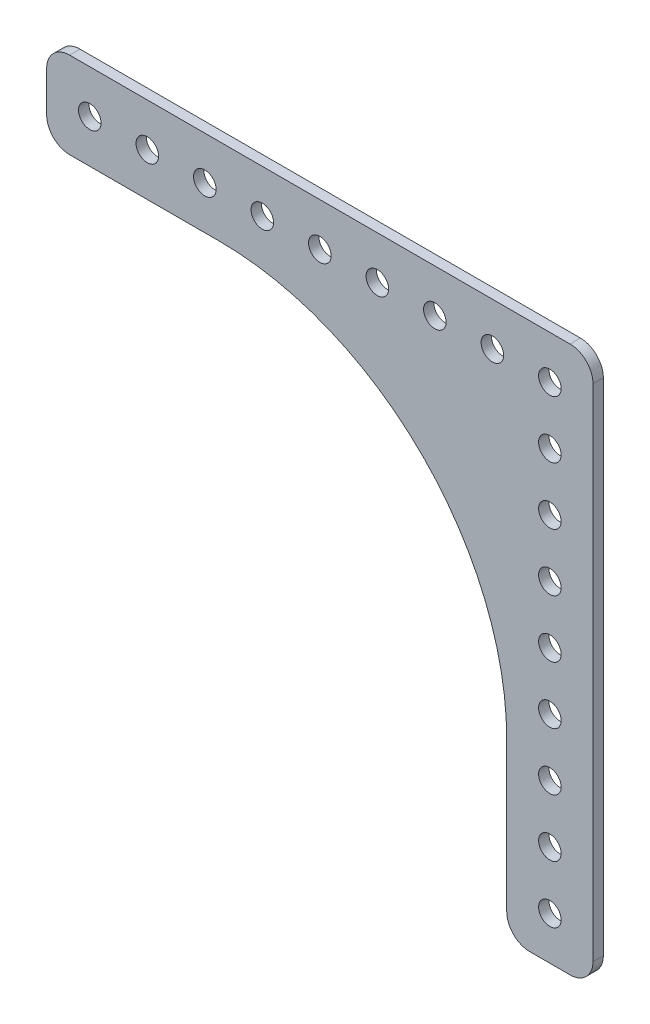
ISO-10303-21;
HEADER;
FILE_DESCRIPTION(('STEP AP214'),'2;1');
FILE_NAME('part.step','',(''),(''),'','','');
FILE_SCHEMA(('AUTOMOTIVE_DESIGN { 1 0 10303 214 1 1 1 1 }'));
ENDSEC;
DATA;
#1=APPLICATION_CONTEXT('core data for automotive mechanical design processes');
#2=APPLICATION_PROTOCOL_DEFINITION('international standard','automotive_design',2000,#1);
#3=PRODUCT_CONTEXT('',#1,'mechanical');
#4=PRODUCT('Part','Part','',(#3));
#5=PRODUCT_RELATED_PRODUCT_CATEGORY('part','',(#4));
#6=PRODUCT_DEFINITION_FORMATION('','',#4);
#7=PRODUCT_DEFINITION_CONTEXT('part definition',#1,'design');
#8=PRODUCT_DEFINITION('design','',#6,#7);
#9=PRODUCT_DEFINITION_SHAPE('','',#8);
#10=(LENGTH_UNIT() NAMED_UNIT(*) SI_UNIT(.MILLI.,.METRE.));
#11=(NAMED_UNIT(*) PLANE_ANGLE_UNIT() SI_UNIT($,.RADIAN.));
#12=(NAMED_UNIT(*) SI_UNIT($,.STERADIAN.) SOLID_ANGLE_UNIT());
#13=UNCERTAINTY_MEASURE_WITH_UNIT(LENGTH_MEASURE(1.E-05),#10,'distance_accuracy_value','');
#14=(GEOMETRIC_REPRESENTATION_CONTEXT(3) GLOBAL_UNCERTAINTY_ASSIGNED_CONTEXT((#13)) GLOBAL_UNIT_ASSIGNED_CONTEXT((#10,
#11,#12)) REPRESENTATION_CONTEXT('',''));
#15=CARTESIAN_POINT('',(0.,0.,0.));
#16=DIRECTION('',(0.,0.,1.));
#17=DIRECTION('',(1.,0.,0.));
#18=AXIS2_PLACEMENT_3D('',#15,#16,#17);
#19=CARTESIAN_POINT('',(459.749472963539,310.157281044466,2.286));
#20=DIRECTION('',(0.,0.,-1.));
#21=DIRECTION('',(-1.,0.,0.));
#22=AXIS2_PLACEMENT_3D('',#19,#20,#21);
#23=PLANE('',#22);
#24=CARTESIAN_POINT('',(459.749472963539,310.157281044466,2.286));
#25=DIRECTION('',(0.,0.,-1.));
#26=DIRECTION('',(-1.,0.,0.));
#27=AXIS2_PLACEMENT_3D('',#24,#25,#26);
#28=CIRCLE('',#27,63.5);
#29=CARTESIAN_POINT('',(459.749472963539,373.657281044466,2.286));
#30=VERTEX_POINT('',#29);
#31=CARTESIAN_POINT('',(523.249472963539,310.157281044466,2.286));
#32=VERTEX_POINT('',#31);
#33=EDGE_CURVE('E178',#30,#32,#28,.T.);
#34=ORIENTED_EDGE('',*,*,#33,.T.);
#35=DIRECTION('',(0.,-1.,0.));
#36=VECTOR('',#35,1.);
#37=CARTESIAN_POINT('',(523.249472963539,277.137281044466,2.286));
#38=LINE('',#37,#36);
#39=CARTESIAN_POINT('',(523.249472963539,277.137281044466,2.286));
#40=VERTEX_POINT('',#39);
#41=EDGE_CURVE('E106',#32,#40,#38,.T.);
#42=ORIENTED_EDGE('',*,*,#41,.T.);
#43=CARTESIAN_POINT('',(528.329472963539,277.137281044466,2.286));
#44=DIRECTION('',(0.,0.,1.));
#45=DIRECTION('',(-1.,0.,0.));
#46=AXIS2_PLACEMENT_3D('',#43,#44,#45);
#47=CIRCLE('',#46,5.07999999999997);
#48=CARTESIAN_POINT('',(528.329472963539,272.057281044466,2.286));
#49=VERTEX_POINT('',#48);
#50=EDGE_CURVE('E205',#40,#49,#47,.T.);
#51=ORIENTED_EDGE('',*,*,#50,.T.);
#52=DIRECTION('',(1.,0.,0.));
#53=VECTOR('',#52,1.);
#54=CARTESIAN_POINT('',(537.219472963539,272.057281044466,2.286));
#55=LINE('',#54,#53);
#56=CARTESIAN_POINT('',(537.219472963539,272.057281044466,2.286));
#57=VERTEX_POINT('',#56);
#58=EDGE_CURVE('E224',#49,#57,#55,.T.);
#59=ORIENTED_EDGE('',*,*,#58,.T.);
#60=CARTESIAN_POINT('',(537.219472963539,277.137281044466,2.286));
#61=DIRECTION('',(0.,0.,1.));
#62=DIRECTION('',(-1.,0.,0.));
#63=AXIS2_PLACEMENT_3D('',#60,#61,#62);
#64=CIRCLE('',#63,5.07999999999997);
#65=CARTESIAN_POINT('',(542.299472963539,277.137281044466,2.286));
#66=VERTEX_POINT('',#65);
#67=EDGE_CURVE('E221',#57,#66,#64,.T.);
#68=ORIENTED_EDGE('',*,*,#67,.T.);
#69=DIRECTION('',(0.,1.,0.));
#70=VECTOR('',#69,1.);
#71=CARTESIAN_POINT('',(542.299472963539,387.627281044466,2.286));
#72=LINE('',#71,#70);
#73=CARTESIAN_POINT('',(542.299472963539,387.627281044466,2.286));
#74=VERTEX_POINT('',#73);
#75=EDGE_CURVE('E223',#66,#74,#72,.T.);
#76=ORIENTED_EDGE('',*,*,#75,.T.);
#77=CARTESIAN_POINT('',(537.219472963539,387.627281044466,2.286));
#78=DIRECTION('',(0.,0.,1.));
#79=DIRECTION('',(-1.,0.,0.));
#80=AXIS2_PLACEMENT_3D('',#77,#78,#79);
#81=CIRCLE('',#80,5.08);
#82=CARTESIAN_POINT('',(537.219472963539,392.707281044466,2.286));
#83=VERTEX_POINT('',#82);
#84=EDGE_CURVE('E226',#74,#83,#81,.T.);
#85=ORIENTED_EDGE('',*,*,#84,.T.);
#86=DIRECTION('',(-1.,0.,0.));
#87=VECTOR('',#86,1.);
#88=CARTESIAN_POINT('',(426.729472963539,392.707281044466,2.286));
#89=LINE('',#88,#87);
#90=CARTESIAN_POINT('',(426.729472963539,392.707281044466,2.286));
#91=VERTEX_POINT('',#90);
#92=EDGE_CURVE('E232',#83,#91,#89,.T.);
#93=ORIENTED_EDGE('',*,*,#92,.T.);
#94=CARTESIAN_POINT('',(426.729472963539,387.627281044466,2.286));
#95=DIRECTION('',(0.,0.,1.));
#96=DIRECTION('',(-1.,0.,0.));
#97=AXIS2_PLACEMENT_3D('',#94,#95,#96);
#98=CIRCLE('',#97,5.08);
#99=CARTESIAN_POINT('',(421.649472963539,387.627281044466,2.286));
#100=VERTEX_POINT('',#99);
#101=EDGE_CURVE('E137',#91,#100,#98,.T.);
#102=ORIENTED_EDGE('',*,*,#101,.T.);
#103=DIRECTION('',(0.,-1.,0.));
#104=VECTOR('',#103,1.);
#105=CARTESIAN_POINT('',(421.649472963539,378.737281044466,2.286));
#106=LINE('',#105,#104);
#107=CARTESIAN_POINT('',(421.649472963539,378.737281044466,2.286));
#108=VERTEX_POINT('',#107);
#109=EDGE_CURVE('E131',#100,#108,#106,.T.);
#110=ORIENTED_EDGE('',*,*,#109,.T.);
#111=CARTESIAN_POINT('',(426.729472963539,378.737281044466,2.286));
#112=DIRECTION('',(0.,0.,1.));
#113=DIRECTION('',(-1.,0.,0.));
#114=AXIS2_PLACEMENT_3D('',#111,#112,#113);
#115=CIRCLE('',#114,5.07999999999995);
#116=CARTESIAN_POINT('',(426.729472963539,373.657281044466,2.286));
#117=VERTEX_POINT('',#116);
#118=EDGE_CURVE('E135',#108,#117,#115,.T.);
#119=ORIENTED_EDGE('',*,*,#118,.T.);
#120=DIRECTION('',(1.,0.,0.));
#121=VECTOR('',#120,1.);
#122=CARTESIAN_POINT('',(459.749472963539,373.657281044466,2.286));
#123=LINE('',#122,#121);
#124=EDGE_CURVE('E51',#117,#30,#123,.T.);
#125=ORIENTED_EDGE('',*,*,#124,.T.);
#126=EDGE_LOOP('',(#34,#42,#51,#59,#68,#76,#85,#93,#102,#110,#119,#125));
#127=FACE_BOUND('',#126,.T.);
#128=CARTESIAN_POINT('',(443.874472963539,383.182281044466,2.286));
#129=DIRECTION('',(0.,0.,1.));
#130=DIRECTION('',(1.,0.,0.));
#131=AXIS2_PLACEMENT_3D('',#128,#129,#130);
#132=CIRCLE('',#131,2.48920000000001);
#133=CARTESIAN_POINT('',(446.363672963539,383.182281044466,2.286));
#134=VERTEX_POINT('',#133);
#135=EDGE_CURVE('E159',#134,#134,#132,.T.);
#136=ORIENTED_EDGE('',*,*,#135,.F.);
#137=EDGE_LOOP('',(#136));
#138=FACE_BOUND('',#137,.T.);
#139=CARTESIAN_POINT('',(431.174472963539,383.182281044466,2.286));
#140=DIRECTION('',(0.,0.,1.));
#141=DIRECTION('',(1.,0.,0.));
#142=AXIS2_PLACEMENT_3D('',#139,#140,#141);
#143=CIRCLE('',#142,2.48920000000001);
#144=CARTESIAN_POINT('',(433.663672963539,383.182281044466,2.286));
#145=VERTEX_POINT('',#144);
#146=EDGE_CURVE('E426',#145,#145,#143,.T.);
#147=ORIENTED_EDGE('',*,*,#146,.F.);
#148=EDGE_LOOP('',(#147));
#149=FACE_BOUND('',#148,.T.);
#150=CARTESIAN_POINT('',(456.574472963539,383.182281044466,2.286));
#151=DIRECTION('',(0.,0.,1.));
#152=DIRECTION('',(1.,0.,0.));
#153=AXIS2_PLACEMENT_3D('',#150,#151,#152);
#154=CIRCLE('',#153,2.48920000000001);
#155=CARTESIAN_POINT('',(459.063672963539,383.182281044466,2.286));
#156=VERTEX_POINT('',#155);
#157=EDGE_CURVE('E420',#156,#156,#154,.T.);
#158=ORIENTED_EDGE('',*,*,#157,.F.);
#159=EDGE_LOOP('',(#158));
#160=FACE_BOUND('',#159,.T.);
#161=CARTESIAN_POINT('',(469.274472963539,383.182281044466,2.286));
#162=DIRECTION('',(0.,0.,1.));
#163=DIRECTION('',(1.,0.,0.));
#164=AXIS2_PLACEMENT_3D('',#161,#162,#163);
#165=CIRCLE('',#164,2.48920000000006);
#166=CARTESIAN_POINT('',(471.763672963539,383.182281044466,2.286));
#167=VERTEX_POINT('',#166);
#168=EDGE_CURVE('E414',#167,#167,#165,.T.);
#169=ORIENTED_EDGE('',*,*,#168,.F.);
#170=EDGE_LOOP('',(#169));
#171=FACE_BOUND('',#170,.T.);
#172=CARTESIAN_POINT('',(481.974472963539,383.182281044466,2.286));
#173=DIRECTION('',(0.,0.,1.));
#174=DIRECTION('',(1.,0.,0.));
#175=AXIS2_PLACEMENT_3D('',#172,#173,#174);
#176=CIRCLE('',#175,2.48919999999983);
#177=CARTESIAN_POINT('',(484.463672963539,383.182281044466,2.286));
#178=VERTEX_POINT('',#177);
#179=EDGE_CURVE('E408',#178,#178,#176,.T.);
#180=ORIENTED_EDGE('',*,*,#179,.F.);
#181=EDGE_LOOP('',(#180));
#182=FACE_BOUND('',#181,.T.);
#183=CARTESIAN_POINT('',(494.674472963539,383.182281044466,2.286));
#184=DIRECTION('',(0.,0.,1.));
#185=DIRECTION('',(1.,0.,0.));
#186=AXIS2_PLACEMENT_3D('',#183,#184,#185);
#187=CIRCLE('',#186,2.48919999999995);
#188=CARTESIAN_POINT('',(497.163672963539,383.182281044466,2.286));
#189=VERTEX_POINT('',#188);
#190=EDGE_CURVE('E402',#189,#189,#187,.T.);
#191=ORIENTED_EDGE('',*,*,#190,.F.);
#192=EDGE_LOOP('',(#191));
#193=FACE_BOUND('',#192,.T.);
#194=CARTESIAN_POINT('',(507.374472963539,383.182281044466,2.286));
#195=DIRECTION('',(0.,0.,1.));
#196=DIRECTION('',(1.,0.,0.));
#197=AXIS2_PLACEMENT_3D('',#194,#195,#196);
#198=CIRCLE('',#197,2.48919999999995);
#199=CARTESIAN_POINT('',(509.863672963539,383.182281044466,2.286));
#200=VERTEX_POINT('',#199);
#201=EDGE_CURVE('E396',#200,#200,#198,.T.);
#202=ORIENTED_EDGE('',*,*,#201,.F.);
#203=EDGE_LOOP('',(#202));
#204=FACE_BOUND('',#203,.T.);
#205=CARTESIAN_POINT('',(520.074472963539,383.182281044466,2.286));
#206=DIRECTION('',(0.,0.,1.));
#207=DIRECTION('',(1.,0.,0.));
#208=AXIS2_PLACEMENT_3D('',#205,#206,#207);
#209=CIRCLE('',#208,2.48919999999995);
#210=CARTESIAN_POINT('',(522.563672963539,383.182281044466,2.286));
#211=VERTEX_POINT('',#210);
#212=EDGE_CURVE('E390',#211,#211,#209,.T.);
#213=ORIENTED_EDGE('',*,*,#212,.F.);
#214=EDGE_LOOP('',(#213));
#215=FACE_BOUND('',#214,.T.);
#216=CARTESIAN_POINT('',(532.774472963539,383.182281044466,2.286));
#217=DIRECTION('',(0.,0.,1.));
#218=DIRECTION('',(1.,0.,0.));
#219=AXIS2_PLACEMENT_3D('',#216,#217,#218);
#220=CIRCLE('',#219,2.48920000000006);
#221=CARTESIAN_POINT('',(535.263672963539,383.182281044466,2.286));
#222=VERTEX_POINT('',#221);
#223=EDGE_CURVE('E384',#222,#222,#220,.T.);
#224=ORIENTED_EDGE('',*,*,#223,.F.);
#225=EDGE_LOOP('',(#224));
#226=FACE_BOUND('',#225,.T.);
#227=CARTESIAN_POINT('',(532.774472963539,370.482281044466,2.286));
#228=DIRECTION('',(0.,0.,1.));
#229=DIRECTION('',(1.,0.,0.));
#230=AXIS2_PLACEMENT_3D('',#227,#228,#229);
#231=CIRCLE('',#230,2.48920000000006);
#232=CARTESIAN_POINT('',(535.263672963539,370.482281044466,2.286));
#233=VERTEX_POINT('',#232);
#234=EDGE_CURVE('E378',#233,#233,#231,.T.);
#235=ORIENTED_EDGE('',*,*,#234,.F.);
#236=EDGE_LOOP('',(#235));
#237=FACE_BOUND('',#236,.T.);
#238=CARTESIAN_POINT('',(532.774472963539,357.782281044466,2.286));
#239=DIRECTION('',(0.,0.,1.));
#240=DIRECTION('',(1.,0.,0.));
#241=AXIS2_PLACEMENT_3D('',#238,#239,#240);
#242=CIRCLE('',#241,2.48920000000006);
#243=CARTESIAN_POINT('',(535.263672963539,357.782281044466,2.286));
#244=VERTEX_POINT('',#243);
#245=EDGE_CURVE('E372',#244,#244,#242,.T.);
#246=ORIENTED_EDGE('',*,*,#245,.F.);
#247=EDGE_LOOP('',(#246));
#248=FACE_BOUND('',#247,.T.);
#249=CARTESIAN_POINT('',(532.774472963539,345.082281044466,2.286));
#250=DIRECTION('',(0.,0.,1.));
#251=DIRECTION('',(1.,0.,0.));
#252=AXIS2_PLACEMENT_3D('',#249,#250,#251);
#253=CIRCLE('',#252,2.48920000000006);
#254=CARTESIAN_POINT('',(535.263672963539,345.082281044466,2.286));
#255=VERTEX_POINT('',#254);
#256=EDGE_CURVE('E366',#255,#255,#253,.T.);
#257=ORIENTED_EDGE('',*,*,#256,.F.);
#258=EDGE_LOOP('',(#257));
#259=FACE_BOUND('',#258,.T.);
#260=CARTESIAN_POINT('',(532.774472963539,332.382281044466,2.286));
#261=DIRECTION('',(0.,0.,1.));
#262=DIRECTION('',(1.,0.,0.));
#263=AXIS2_PLACEMENT_3D('',#260,#261,#262);
#264=CIRCLE('',#263,2.48920000000006);
#265=CARTESIAN_POINT('',(535.263672963539,332.382281044466,2.286));
#266=VERTEX_POINT('',#265);
#267=EDGE_CURVE('E360',#266,#266,#264,.T.);
#268=ORIENTED_EDGE('',*,*,#267,.F.);
#269=EDGE_LOOP('',(#268));
#270=FACE_BOUND('',#269,.T.);
#271=CARTESIAN_POINT('',(532.774472963539,319.682281044466,2.286));
#272=DIRECTION('',(0.,0.,1.));
#273=DIRECTION('',(1.,0.,0.));
#274=AXIS2_PLACEMENT_3D('',#271,#272,#273);
#275=CIRCLE('',#274,2.48920000000006);
#276=CARTESIAN_POINT('',(535.263672963539,319.682281044466,2.286));
#277=VERTEX_POINT('',#276);
#278=EDGE_CURVE('E354',#277,#277,#275,.T.);
#279=ORIENTED_EDGE('',*,*,#278,.F.);
#280=EDGE_LOOP('',(#279));
#281=FACE_BOUND('',#280,.T.);
#282=CARTESIAN_POINT('',(532.774472963539,306.982281044466,2.286));
#283=DIRECTION('',(0.,0.,1.));
#284=DIRECTION('',(1.,0.,0.));
#285=AXIS2_PLACEMENT_3D('',#282,#283,#284);
#286=CIRCLE('',#285,2.48920000000006);
#287=CARTESIAN_POINT('',(535.263672963539,306.982281044466,2.286));
#288=VERTEX_POINT('',#287);
#289=EDGE_CURVE('E348',#288,#288,#286,.T.);
#290=ORIENTED_EDGE('',*,*,#289,.F.);
#291=EDGE_LOOP('',(#290));
#292=FACE_BOUND('',#291,.T.);
#293=CARTESIAN_POINT('',(532.774472963539,294.282281044466,2.286));
#294=DIRECTION('',(0.,0.,1.));
#295=DIRECTION('',(1.,0.,0.));
#296=AXIS2_PLACEMENT_3D('',#293,#294,#295);
#297=CIRCLE('',#296,2.48920000000006);
#298=CARTESIAN_POINT('',(535.263672963539,294.282281044466,2.286));
#299=VERTEX_POINT('',#298);
#300=EDGE_CURVE('E342',#299,#299,#297,.T.);
#301=ORIENTED_EDGE('',*,*,#300,.F.);
#302=EDGE_LOOP('',(#301));
#303=FACE_BOUND('',#302,.T.);
#304=CARTESIAN_POINT('',(532.774472963539,281.582281044466,2.286));
#305=DIRECTION('',(0.,0.,1.));
#306=DIRECTION('',(1.,0.,0.));
#307=AXIS2_PLACEMENT_3D('',#304,#305,#306);
#308=CIRCLE('',#307,2.48920000000006);
#309=CARTESIAN_POINT('',(535.263672963539,281.582281044466,2.286));
#310=VERTEX_POINT('',#309);
#311=EDGE_CURVE('E333',#310,#310,#308,.T.);
#312=ORIENTED_EDGE('',*,*,#311,.F.);
#313=EDGE_LOOP('',(#312));
#314=FACE_BOUND('',#313,.T.);
#315=ADVANCED_FACE('F34',(#127,#138,#149,#160,#171,#182,#193,#204,#215,#226,#237,#248,#259,#270,
#281,#292,#303,#314),#23,.F.);
#316=CARTESIAN_POINT('',(459.749472963539,310.157281044466,0.));
#317=DIRECTION('',(0.,0.,-1.));
#318=DIRECTION('',(-1.,0.,0.));
#319=AXIS2_PLACEMENT_3D('',#316,#317,#318);
#320=PLANE('',#319);
#321=CARTESIAN_POINT('',(532.774472963539,294.282281044466,0.));
#322=DIRECTION('',(0.,0.,1.));
#323=DIRECTION('',(1.,0.,0.));
#324=AXIS2_PLACEMENT_3D('',#321,#322,#323);
#325=CIRCLE('',#324,2.48920000000006);
#326=CARTESIAN_POINT('',(535.263672963539,294.282281044466,0.));
#327=VERTEX_POINT('',#326);
#328=EDGE_CURVE('E339',#327,#327,#325,.T.);
#329=ORIENTED_EDGE('',*,*,#328,.T.);
#330=EDGE_LOOP('',(#329));
#331=FACE_BOUND('',#330,.T.);
#332=CARTESIAN_POINT('',(532.774472963539,319.682281044466,0.));
#333=DIRECTION('',(0.,0.,1.));
#334=DIRECTION('',(1.,0.,0.));
#335=AXIS2_PLACEMENT_3D('',#332,#333,#334);
#336=CIRCLE('',#335,2.48920000000006);
#337=CARTESIAN_POINT('',(535.263672963539,319.682281044466,0.));
#338=VERTEX_POINT('',#337);
#339=EDGE_CURVE('E351',#338,#338,#336,.T.);
#340=ORIENTED_EDGE('',*,*,#339,.T.);
#341=EDGE_LOOP('',(#340));
#342=FACE_BOUND('',#341,.T.);
#343=CARTESIAN_POINT('',(532.774472963539,345.082281044466,0.));
#344=DIRECTION('',(0.,0.,1.));
#345=DIRECTION('',(1.,0.,0.));
#346=AXIS2_PLACEMENT_3D('',#343,#344,#345);
#347=CIRCLE('',#346,2.48920000000006);
#348=CARTESIAN_POINT('',(535.263672963539,345.082281044466,0.));
#349=VERTEX_POINT('',#348);
#350=EDGE_CURVE('E363',#349,#349,#347,.T.);
#351=ORIENTED_EDGE('',*,*,#350,.T.);
#352=EDGE_LOOP('',(#351));
#353=FACE_BOUND('',#352,.T.);
#354=CARTESIAN_POINT('',(532.774472963539,370.482281044466,0.));
#355=DIRECTION('',(0.,0.,1.));
#356=DIRECTION('',(1.,0.,0.));
#357=AXIS2_PLACEMENT_3D('',#354,#355,#356);
#358=CIRCLE('',#357,2.48920000000006);
#359=CARTESIAN_POINT('',(535.263672963539,370.482281044466,0.));
#360=VERTEX_POINT('',#359);
#361=EDGE_CURVE('E375',#360,#360,#358,.T.);
#362=ORIENTED_EDGE('',*,*,#361,.T.);
#363=EDGE_LOOP('',(#362));
#364=FACE_BOUND('',#363,.T.);
#365=CARTESIAN_POINT('',(520.074472963539,383.182281044466,0.));
#366=DIRECTION('',(0.,0.,1.));
#367=DIRECTION('',(1.,0.,0.));
#368=AXIS2_PLACEMENT_3D('',#365,#366,#367);
#369=CIRCLE('',#368,2.48919999999995);
#370=CARTESIAN_POINT('',(522.563672963539,383.182281044466,0.));
#371=VERTEX_POINT('',#370);
#372=EDGE_CURVE('E387',#371,#371,#369,.T.);
#373=ORIENTED_EDGE('',*,*,#372,.T.);
#374=EDGE_LOOP('',(#373));
#375=FACE_BOUND('',#374,.T.);
#376=CARTESIAN_POINT('',(494.674472963539,383.182281044466,0.));
#377=DIRECTION('',(0.,0.,1.));
#378=DIRECTION('',(1.,0.,0.));
#379=AXIS2_PLACEMENT_3D('',#376,#377,#378);
#380=CIRCLE('',#379,2.48919999999995);
#381=CARTESIAN_POINT('',(497.163672963539,383.182281044466,0.));
#382=VERTEX_POINT('',#381);
#383=EDGE_CURVE('E399',#382,#382,#380,.T.);
#384=ORIENTED_EDGE('',*,*,#383,.T.);
#385=EDGE_LOOP('',(#384));
#386=FACE_BOUND('',#385,.T.);
#387=CARTESIAN_POINT('',(469.274472963539,383.182281044466,0.));
#388=DIRECTION('',(0.,0.,1.));
#389=DIRECTION('',(1.,0.,0.));
#390=AXIS2_PLACEMENT_3D('',#387,#388,#389);
#391=CIRCLE('',#390,2.48920000000006);
#392=CARTESIAN_POINT('',(471.763672963539,383.182281044466,0.));
#393=VERTEX_POINT('',#392);
#394=EDGE_CURVE('E411',#393,#393,#391,.T.);
#395=ORIENTED_EDGE('',*,*,#394,.T.);
#396=EDGE_LOOP('',(#395));
#397=FACE_BOUND('',#396,.T.);
#398=CARTESIAN_POINT('',(431.174472963539,383.182281044466,0.));
#399=DIRECTION('',(0.,0.,1.));
#400=DIRECTION('',(1.,0.,0.));
#401=AXIS2_PLACEMENT_3D('',#398,#399,#400);
#402=CIRCLE('',#401,2.48920000000001);
#403=CARTESIAN_POINT('',(433.663672963539,383.182281044466,0.));
#404=VERTEX_POINT('',#403);
#405=EDGE_CURVE('E423',#404,#404,#402,.T.);
#406=ORIENTED_EDGE('',*,*,#405,.T.);
#407=EDGE_LOOP('',(#406));
#408=FACE_BOUND('',#407,.T.);
#409=CARTESIAN_POINT('',(459.749472963539,310.157281044466,0.));
#410=DIRECTION('',(0.,0.,-1.));
#411=DIRECTION('',(-1.,0.,0.));
#412=AXIS2_PLACEMENT_3D('',#409,#410,#411);
#413=CIRCLE('',#412,63.5);
#414=CARTESIAN_POINT('',(459.749472963539,373.657281044466,0.));
#415=VERTEX_POINT('',#414);
#416=CARTESIAN_POINT('',(523.249472963539,310.157281044466,0.));
#417=VERTEX_POINT('',#416);
#418=EDGE_CURVE('E155',#415,#417,#413,.T.);
#419=ORIENTED_EDGE('',*,*,#418,.F.);
#420=DIRECTION('',(1.,0.,0.));
#421=VECTOR('',#420,1.);
#422=CARTESIAN_POINT('',(459.749472963539,373.657281044466,0.));
#423=LINE('',#422,#421);
#424=CARTESIAN_POINT('',(426.729472963539,373.657281044466,0.));
#425=VERTEX_POINT('',#424);
#426=EDGE_CURVE('E98',#425,#415,#423,.T.);
#427=ORIENTED_EDGE('',*,*,#426,.F.);
#428=CARTESIAN_POINT('',(426.729472963539,378.737281044466,0.));
#429=DIRECTION('',(0.,0.,1.));
#430=DIRECTION('',(-1.,0.,0.));
#431=AXIS2_PLACEMENT_3D('',#428,#429,#430);
#432=CIRCLE('',#431,5.07999999999995);
#433=CARTESIAN_POINT('',(421.649472963539,378.737281044466,0.));
#434=VERTEX_POINT('',#433);
#435=EDGE_CURVE('E92',#434,#425,#432,.T.);
#436=ORIENTED_EDGE('',*,*,#435,.F.);
#437=DIRECTION('',(0.,-1.,0.));
#438=VECTOR('',#437,1.);
#439=CARTESIAN_POINT('',(421.649472963539,378.737281044466,0.));
#440=LINE('',#439,#438);
#441=CARTESIAN_POINT('',(421.649472963539,387.627281044466,0.));
#442=VERTEX_POINT('',#441);
#443=EDGE_CURVE('E145',#442,#434,#440,.T.);
#444=ORIENTED_EDGE('',*,*,#443,.F.);
#445=CARTESIAN_POINT('',(426.729472963539,387.627281044466,0.));
#446=DIRECTION('',(0.,0.,1.));
#447=DIRECTION('',(-1.,0.,0.));
#448=AXIS2_PLACEMENT_3D('',#445,#446,#447);
#449=CIRCLE('',#448,5.08);
#450=CARTESIAN_POINT('',(426.729472963539,392.707281044466,0.));
#451=VERTEX_POINT('',#450);
#452=EDGE_CURVE('E173',#451,#442,#449,.T.);
#453=ORIENTED_EDGE('',*,*,#452,.F.);
#454=DIRECTION('',(-1.,0.,0.));
#455=VECTOR('',#454,1.);
#456=CARTESIAN_POINT('',(426.729472963539,392.707281044466,0.));
#457=LINE('',#456,#455);
#458=CARTESIAN_POINT('',(537.219472963539,392.707281044466,0.));
#459=VERTEX_POINT('',#458);
#460=EDGE_CURVE('E171',#459,#451,#457,.T.);
#461=ORIENTED_EDGE('',*,*,#460,.F.);
#462=CARTESIAN_POINT('',(537.219472963539,387.627281044466,0.));
#463=DIRECTION('',(0.,0.,1.));
#464=DIRECTION('',(-1.,0.,0.));
#465=AXIS2_PLACEMENT_3D('',#462,#463,#464);
#466=CIRCLE('',#465,5.08);
#467=CARTESIAN_POINT('',(542.299472963539,387.627281044466,0.));
#468=VERTEX_POINT('',#467);
#469=EDGE_CURVE('E169',#468,#459,#466,.T.);
#470=ORIENTED_EDGE('',*,*,#469,.F.);
#471=DIRECTION('',(0.,1.,0.));
#472=VECTOR('',#471,1.);
#473=CARTESIAN_POINT('',(542.299472963539,387.627281044466,0.));
#474=LINE('',#473,#472);
#475=CARTESIAN_POINT('',(542.299472963539,277.137281044466,0.));
#476=VERTEX_POINT('',#475);
#477=EDGE_CURVE('E167',#476,#468,#474,.T.);
#478=ORIENTED_EDGE('',*,*,#477,.F.);
#479=CARTESIAN_POINT('',(537.219472963539,277.137281044466,0.));
#480=DIRECTION('',(0.,0.,1.));
#481=DIRECTION('',(-1.,0.,0.));
#482=AXIS2_PLACEMENT_3D('',#479,#480,#481);
#483=CIRCLE('',#482,5.07999999999997);
#484=CARTESIAN_POINT('',(537.219472963539,272.057281044466,0.));
#485=VERTEX_POINT('',#484);
#486=EDGE_CURVE('E165',#485,#476,#483,.T.);
#487=ORIENTED_EDGE('',*,*,#486,.F.);
#488=DIRECTION('',(1.,0.,0.));
#489=VECTOR('',#488,1.);
#490=CARTESIAN_POINT('',(537.219472963539,272.057281044466,0.));
#491=LINE('',#490,#489);
#492=CARTESIAN_POINT('',(528.329472963539,272.057281044466,0.));
#493=VERTEX_POINT('',#492);
#494=EDGE_CURVE('E163',#493,#485,#491,.T.);
#495=ORIENTED_EDGE('',*,*,#494,.F.);
#496=CARTESIAN_POINT('',(528.329472963539,277.137281044466,0.));
#497=DIRECTION('',(0.,0.,1.));
#498=DIRECTION('',(-1.,0.,0.));
#499=AXIS2_PLACEMENT_3D('',#496,#497,#498);
#500=CIRCLE('',#499,5.07999999999997);
#501=CARTESIAN_POINT('',(523.249472963539,277.137281044466,0.));
#502=VERTEX_POINT('',#501);
#503=EDGE_CURVE('E161',#502,#493,#500,.T.);
#504=ORIENTED_EDGE('',*,*,#503,.F.);
#505=DIRECTION('',(0.,-1.,0.));
#506=VECTOR('',#505,1.);
#507=CARTESIAN_POINT('',(523.249472963539,277.137281044466,0.));
#508=LINE('',#507,#506);
#509=EDGE_CURVE('E158',#417,#502,#508,.T.);
#510=ORIENTED_EDGE('',*,*,#509,.F.);
#511=EDGE_LOOP('',(#419,#427,#436,#444,#453,#461,#470,#478,#487,#495,#504,#510));
#512=FACE_BOUND('',#511,.T.);
#513=CARTESIAN_POINT('',(443.874472963539,383.182281044466,0.));
#514=DIRECTION('',(0.,0.,1.));
#515=DIRECTION('',(1.,0.,0.));
#516=AXIS2_PLACEMENT_3D('',#513,#514,#515);
#517=CIRCLE('',#516,2.48920000000001);
#518=CARTESIAN_POINT('',(446.363672963539,383.182281044466,0.));
#519=VERTEX_POINT('',#518);
#520=EDGE_CURVE('E429',#519,#519,#517,.T.);
#521=ORIENTED_EDGE('',*,*,#520,.T.);
#522=EDGE_LOOP('',(#521));
#523=FACE_BOUND('',#522,.T.);
#524=CARTESIAN_POINT('',(456.574472963539,383.182281044466,0.));
#525=DIRECTION('',(0.,0.,1.));
#526=DIRECTION('',(1.,0.,0.));
#527=AXIS2_PLACEMENT_3D('',#524,#525,#526);
#528=CIRCLE('',#527,2.48920000000001);
#529=CARTESIAN_POINT('',(459.063672963539,383.182281044466,0.));
#530=VERTEX_POINT('',#529);
#531=EDGE_CURVE('E417',#530,#530,#528,.T.);
#532=ORIENTED_EDGE('',*,*,#531,.T.);
#533=EDGE_LOOP('',(#532));
#534=FACE_BOUND('',#533,.T.);
#535=CARTESIAN_POINT('',(481.974472963539,383.182281044466,0.));
#536=DIRECTION('',(0.,0.,1.));
#537=DIRECTION('',(1.,0.,0.));
#538=AXIS2_PLACEMENT_3D('',#535,#536,#537);
#539=CIRCLE('',#538,2.48919999999983);
#540=CARTESIAN_POINT('',(484.463672963539,383.182281044466,0.));
#541=VERTEX_POINT('',#540);
#542=EDGE_CURVE('E405',#541,#541,#539,.T.);
#543=ORIENTED_EDGE('',*,*,#542,.T.);
#544=EDGE_LOOP('',(#543));
#545=FACE_BOUND('',#544,.T.);
#546=CARTESIAN_POINT('',(507.374472963539,383.182281044466,0.));
#547=DIRECTION('',(0.,0.,1.));
#548=DIRECTION('',(1.,0.,0.));
#549=AXIS2_PLACEMENT_3D('',#546,#547,#548);
#550=CIRCLE('',#549,2.48919999999995);
#551=CARTESIAN_POINT('',(509.863672963539,383.182281044466,0.));
#552=VERTEX_POINT('',#551);
#553=EDGE_CURVE('E393',#552,#552,#550,.T.);
#554=ORIENTED_EDGE('',*,*,#553,.T.);
#555=EDGE_LOOP('',(#554));
#556=FACE_BOUND('',#555,.T.);
#557=CARTESIAN_POINT('',(532.774472963539,383.182281044466,0.));
#558=DIRECTION('',(0.,0.,1.));
#559=DIRECTION('',(1.,0.,0.));
#560=AXIS2_PLACEMENT_3D('',#557,#558,#559);
#561=CIRCLE('',#560,2.48920000000006);
#562=CARTESIAN_POINT('',(535.263672963539,383.182281044466,0.));
#563=VERTEX_POINT('',#562);
#564=EDGE_CURVE('E381',#563,#563,#561,.T.);
#565=ORIENTED_EDGE('',*,*,#564,.T.);
#566=EDGE_LOOP('',(#565));
#567=FACE_BOUND('',#566,.T.);
#568=CARTESIAN_POINT('',(532.774472963539,357.782281044466,0.));
#569=DIRECTION('',(0.,0.,1.));
#570=DIRECTION('',(1.,0.,0.));
#571=AXIS2_PLACEMENT_3D('',#568,#569,#570);
#572=CIRCLE('',#571,2.48920000000006);
#573=CARTESIAN_POINT('',(535.263672963539,357.782281044466,0.));
#574=VERTEX_POINT('',#573);
#575=EDGE_CURVE('E369',#574,#574,#572,.T.);
#576=ORIENTED_EDGE('',*,*,#575,.T.);
#577=EDGE_LOOP('',(#576));
#578=FACE_BOUND('',#577,.T.);
#579=CARTESIAN_POINT('',(532.774472963539,332.382281044466,0.));
#580=DIRECTION('',(0.,0.,1.));
#581=DIRECTION('',(1.,0.,0.));
#582=AXIS2_PLACEMENT_3D('',#579,#580,#581);
#583=CIRCLE('',#582,2.48920000000006);
#584=CARTESIAN_POINT('',(535.263672963539,332.382281044466,0.));
#585=VERTEX_POINT('',#584);
#586=EDGE_CURVE('E357',#585,#585,#583,.T.);
#587=ORIENTED_EDGE('',*,*,#586,.T.);
#588=EDGE_LOOP('',(#587));
#589=FACE_BOUND('',#588,.T.);
#590=CARTESIAN_POINT('',(532.774472963539,306.982281044466,0.));
#591=DIRECTION('',(0.,0.,1.));
#592=DIRECTION('',(1.,0.,0.));
#593=AXIS2_PLACEMENT_3D('',#590,#591,#592);
#594=CIRCLE('',#593,2.48920000000006);
#595=CARTESIAN_POINT('',(535.263672963539,306.982281044466,0.));
#596=VERTEX_POINT('',#595);
#597=EDGE_CURVE('E345',#596,#596,#594,.T.);
#598=ORIENTED_EDGE('',*,*,#597,.T.);
#599=EDGE_LOOP('',(#598));
#600=FACE_BOUND('',#599,.T.);
#601=CARTESIAN_POINT('',(532.774472963539,281.582281044466,0.));
#602=DIRECTION('',(0.,0.,1.));
#603=DIRECTION('',(1.,0.,0.));
#604=AXIS2_PLACEMENT_3D('',#601,#602,#603);
#605=CIRCLE('',#604,2.48920000000006);
#606=CARTESIAN_POINT('',(535.263672963539,281.582281044466,0.));
#607=VERTEX_POINT('',#606);
#608=EDGE_CURVE('E336',#607,#607,#605,.T.);
#609=ORIENTED_EDGE('',*,*,#608,.T.);
#610=EDGE_LOOP('',(#609));
#611=FACE_BOUND('',#610,.T.);
#612=ADVANCED_FACE('F209',(#331,#342,#353,#364,#375,#386,#397,#408,#512,#523,#534,#545,#556,
#567,#578,#589,#600,#611),#320,.T.);
#613=CARTESIAN_POINT('',(459.749472963539,310.157281044466,2.286));
#614=DIRECTION('',(0.,0.,-1.));
#615=DIRECTION('',(-1.,0.,0.));
#616=AXIS2_PLACEMENT_3D('',#613,#614,#615);
#617=CYLINDRICAL_SURFACE('',#616,63.5);
#618=ORIENTED_EDGE('',*,*,#418,.T.);
#619=DIRECTION('',(0.,0.,-1.));
#620=VECTOR('',#619,1.);
#621=CARTESIAN_POINT('',(523.249472963539,310.157281044466,2.286));
#622=LINE('',#621,#620);
#623=EDGE_CURVE('E11',#32,#417,#622,.T.);
#624=ORIENTED_EDGE('',*,*,#623,.F.);
#625=ORIENTED_EDGE('',*,*,#33,.F.);
#626=DIRECTION('',(0.,0.,-1.));
#627=VECTOR('',#626,1.);
#628=CARTESIAN_POINT('',(459.749472963539,373.657281044466,2.286));
#629=LINE('',#628,#627);
#630=EDGE_CURVE('E151',#30,#415,#629,.T.);
#631=ORIENTED_EDGE('',*,*,#630,.T.);
#632=EDGE_LOOP('',(#618,#624,#625,#631));
#633=FACE_BOUND('',#632,.T.);
#634=ADVANCED_FACE('F36',(#633),#617,.F.);
#635=CARTESIAN_POINT('',(523.249472963539,277.137281044466,2.286));
#636=DIRECTION('',(1.,0.,0.));
#637=DIRECTION('',(0.,0.,-1.));
#638=AXIS2_PLACEMENT_3D('',#635,#636,#637);
#639=PLANE('',#638);
#640=ORIENTED_EDGE('',*,*,#509,.T.);
#641=DIRECTION('',(0.,0.,-1.));
#642=VECTOR('',#641,1.);
#643=CARTESIAN_POINT('',(523.249472963539,277.137281044466,2.286));
#644=LINE('',#643,#642);
#645=EDGE_CURVE('E43',#40,#502,#644,.T.);
#646=ORIENTED_EDGE('',*,*,#645,.F.);
#647=ORIENTED_EDGE('',*,*,#41,.F.);
#648=ORIENTED_EDGE('',*,*,#623,.T.);
#649=EDGE_LOOP('',(#640,#646,#647,#648));
#650=FACE_BOUND('',#649,.T.);
#651=ADVANCED_FACE('F658',(#650),#639,.F.);
#652=CARTESIAN_POINT('',(528.329472963539,277.137281044466,2.286));
#653=DIRECTION('',(0.,0.,-1.));
#654=DIRECTION('',(-1.,0.,0.));
#655=AXIS2_PLACEMENT_3D('',#652,#653,#654);
#656=CYLINDRICAL_SURFACE('',#655,5.07999999999997);
#657=ORIENTED_EDGE('',*,*,#503,.T.);
#658=DIRECTION('',(0.,0.,-1.));
#659=VECTOR('',#658,1.);
#660=CARTESIAN_POINT('',(528.329472963539,272.057281044466,2.286));
#661=LINE('',#660,#659);
#662=EDGE_CURVE('E197',#49,#493,#661,.T.);
#663=ORIENTED_EDGE('',*,*,#662,.F.);
#664=ORIENTED_EDGE('',*,*,#50,.F.);
#665=ORIENTED_EDGE('',*,*,#645,.T.);
#666=EDGE_LOOP('',(#657,#663,#664,#665));
#667=FACE_BOUND('',#666,.T.);
#668=ADVANCED_FACE('F203',(#667),#656,.T.);
#669=CARTESIAN_POINT('',(537.219472963539,272.057281044466,2.286));
#670=DIRECTION('',(0.,1.,0.));
#671=DIRECTION('',(0.,0.,1.));
#672=AXIS2_PLACEMENT_3D('',#669,#670,#671);
#673=PLANE('',#672);
#674=ORIENTED_EDGE('',*,*,#494,.T.);
#675=DIRECTION('',(0.,0.,-1.));
#676=VECTOR('',#675,1.);
#677=CARTESIAN_POINT('',(537.219472963539,272.057281044466,2.286));
#678=LINE('',#677,#676);
#679=EDGE_CURVE('E194',#57,#485,#678,.T.);
#680=ORIENTED_EDGE('',*,*,#679,.F.);
#681=ORIENTED_EDGE('',*,*,#58,.F.);
#682=ORIENTED_EDGE('',*,*,#662,.T.);
#683=EDGE_LOOP('',(#674,#680,#681,#682));
#684=FACE_BOUND('',#683,.T.);
#685=ADVANCED_FACE('F215',(#684),#673,.F.);
#686=CARTESIAN_POINT('',(537.219472963539,277.137281044466,2.286));
#687=DIRECTION('',(0.,0.,-1.));
#688=DIRECTION('',(-1.,0.,0.));
#689=AXIS2_PLACEMENT_3D('',#686,#687,#688);
#690=CYLINDRICAL_SURFACE('',#689,5.07999999999997);
#691=ORIENTED_EDGE('',*,*,#486,.T.);
#692=DIRECTION('',(0.,0.,-1.));
#693=VECTOR('',#692,1.);
#694=CARTESIAN_POINT('',(542.299472963539,277.137281044466,2.286));
#695=LINE('',#694,#693);
#696=EDGE_CURVE('E191',#66,#476,#695,.T.);
#697=ORIENTED_EDGE('',*,*,#696,.F.);
#698=ORIENTED_EDGE('',*,*,#67,.F.);
#699=ORIENTED_EDGE('',*,*,#679,.T.);
#700=EDGE_LOOP('',(#691,#697,#698,#699));
#701=FACE_BOUND('',#700,.T.);
#702=ADVANCED_FACE('F219',(#701),#690,.T.);
#703=CARTESIAN_POINT('',(542.299472963539,387.627281044466,2.286));
#704=DIRECTION('',(-1.,0.,0.));
#705=DIRECTION('',(0.,0.,1.));
#706=AXIS2_PLACEMENT_3D('',#703,#704,#705);
#707=PLANE('',#706);
#708=ORIENTED_EDGE('',*,*,#477,.T.);
#709=DIRECTION('',(0.,0.,-1.));
#710=VECTOR('',#709,1.);
#711=CARTESIAN_POINT('',(542.299472963539,387.627281044466,2.286));
#712=LINE('',#711,#710);
#713=EDGE_CURVE('E188',#74,#468,#712,.T.);
#714=ORIENTED_EDGE('',*,*,#713,.F.);
#715=ORIENTED_EDGE('',*,*,#75,.F.);
#716=ORIENTED_EDGE('',*,*,#696,.T.);
#717=EDGE_LOOP('',(#708,#714,#715,#716));
#718=FACE_BOUND('',#717,.T.);
#719=ADVANCED_FACE('F623',(#718),#707,.F.);
#720=CARTESIAN_POINT('',(537.219472963539,387.627281044466,2.286));
#721=DIRECTION('',(0.,0.,-1.));
#722=DIRECTION('',(-1.,0.,0.));
#723=AXIS2_PLACEMENT_3D('',#720,#721,#722);
#724=CYLINDRICAL_SURFACE('',#723,5.08);
#725=ORIENTED_EDGE('',*,*,#469,.T.);
#726=DIRECTION('',(0.,0.,-1.));
#727=VECTOR('',#726,1.);
#728=CARTESIAN_POINT('',(537.219472963539,392.707281044466,2.286));
#729=LINE('',#728,#727);
#730=EDGE_CURVE('E185',#83,#459,#729,.T.);
#731=ORIENTED_EDGE('',*,*,#730,.F.);
#732=ORIENTED_EDGE('',*,*,#84,.F.);
#733=ORIENTED_EDGE('',*,*,#713,.T.);
#734=EDGE_LOOP('',(#725,#731,#732,#733));
#735=FACE_BOUND('',#734,.T.);
#736=ADVANCED_FACE('F614',(#735),#724,.T.);
#737=CARTESIAN_POINT('',(426.729472963539,392.707281044466,2.286));
#738=DIRECTION('',(0.,-1.,0.));
#739=DIRECTION('',(1.,0.,0.));
#740=AXIS2_PLACEMENT_3D('',#737,#738,#739);
#741=PLANE('',#740);
#742=ORIENTED_EDGE('',*,*,#460,.T.);
#743=DIRECTION('',(0.,0.,-1.));
#744=VECTOR('',#743,1.);
#745=CARTESIAN_POINT('',(426.729472963539,392.707281044466,2.286));
#746=LINE('',#745,#744);
#747=EDGE_CURVE('E182',#91,#451,#746,.T.);
#748=ORIENTED_EDGE('',*,*,#747,.F.);
#749=ORIENTED_EDGE('',*,*,#92,.F.);
#750=ORIENTED_EDGE('',*,*,#730,.T.);
#751=EDGE_LOOP('',(#742,#748,#749,#750));
#752=FACE_BOUND('',#751,.T.);
#753=ADVANCED_FACE('F238',(#752),#741,.F.);
#754=CARTESIAN_POINT('',(426.729472963539,387.627281044466,2.286));
#755=DIRECTION('',(0.,0.,-1.));
#756=DIRECTION('',(-1.,0.,0.));
#757=AXIS2_PLACEMENT_3D('',#754,#755,#756);
#758=CYLINDRICAL_SURFACE('',#757,5.08);
#759=ORIENTED_EDGE('',*,*,#452,.T.);
#760=DIRECTION('',(0.,0.,-1.));
#761=VECTOR('',#760,1.);
#762=CARTESIAN_POINT('',(421.649472963539,387.627281044466,2.286));
#763=LINE('',#762,#761);
#764=EDGE_CURVE('E146',#100,#442,#763,.T.);
#765=ORIENTED_EDGE('',*,*,#764,.F.);
#766=ORIENTED_EDGE('',*,*,#101,.F.);
#767=ORIENTED_EDGE('',*,*,#747,.T.);
#768=EDGE_LOOP('',(#759,#765,#766,#767));
#769=FACE_BOUND('',#768,.T.);
#770=ADVANCED_FACE('F242',(#769),#758,.T.);
#771=CARTESIAN_POINT('',(421.649472963539,378.737281044466,2.286));
#772=DIRECTION('',(1.,0.,0.));
#773=DIRECTION('',(0.,1.,0.));
#774=AXIS2_PLACEMENT_3D('',#771,#772,#773);
#775=PLANE('',#774);
#776=ORIENTED_EDGE('',*,*,#443,.T.);
#777=DIRECTION('',(0.,0.,-1.));
#778=VECTOR('',#777,1.);
#779=CARTESIAN_POINT('',(421.649472963539,378.737281044466,2.286));
#780=LINE('',#779,#778);
#781=EDGE_CURVE('E142',#108,#434,#780,.T.);
#782=ORIENTED_EDGE('',*,*,#781,.F.);
#783=ORIENTED_EDGE('',*,*,#109,.F.);
#784=ORIENTED_EDGE('',*,*,#764,.T.);
#785=EDGE_LOOP('',(#776,#782,#783,#784));
#786=FACE_BOUND('',#785,.T.);
#787=ADVANCED_FACE('F143',(#786),#775,.F.);
#788=CARTESIAN_POINT('',(426.729472963539,378.737281044466,2.286));
#789=DIRECTION('',(0.,0.,-1.));
#790=DIRECTION('',(-1.,0.,0.));
#791=AXIS2_PLACEMENT_3D('',#788,#789,#790);
#792=CYLINDRICAL_SURFACE('',#791,5.07999999999995);
#793=ORIENTED_EDGE('',*,*,#435,.T.);
#794=DIRECTION('',(0.,0.,-1.));
#795=VECTOR('',#794,1.);
#796=CARTESIAN_POINT('',(426.729472963539,373.657281044466,2.286));
#797=LINE('',#796,#795);
#798=EDGE_CURVE('E147',#117,#425,#797,.T.);
#799=ORIENTED_EDGE('',*,*,#798,.F.);
#800=ORIENTED_EDGE('',*,*,#118,.F.);
#801=ORIENTED_EDGE('',*,*,#781,.T.);
#802=EDGE_LOOP('',(#793,#799,#800,#801));
#803=FACE_BOUND('',#802,.T.);
#804=ADVANCED_FACE('F149',(#803),#792,.T.);
#805=CARTESIAN_POINT('',(459.749472963539,373.657281044466,2.286));
#806=DIRECTION('',(0.,1.,0.));
#807=DIRECTION('',(0.,0.,1.));
#808=AXIS2_PLACEMENT_3D('',#805,#806,#807);
#809=PLANE('',#808);
#810=ORIENTED_EDGE('',*,*,#426,.T.);
#811=ORIENTED_EDGE('',*,*,#630,.F.);
#812=ORIENTED_EDGE('',*,*,#124,.F.);
#813=ORIENTED_EDGE('',*,*,#798,.T.);
#814=EDGE_LOOP('',(#810,#811,#812,#813));
#815=FACE_BOUND('',#814,.T.);
#816=ADVANCED_FACE('F246',(#815),#809,.F.);
#817=CARTESIAN_POINT('',(443.874472963539,383.182281044466,2.286));
#818=DIRECTION('',(0.,0.,-1.));
#819=DIRECTION('',(-1.,0.,0.));
#820=AXIS2_PLACEMENT_3D('',#817,#818,#819);
#821=CYLINDRICAL_SURFACE('',#820,2.48920000000001);
#822=ORIENTED_EDGE('',*,*,#135,.T.);
#823=EDGE_LOOP('',(#822));
#824=FACE_BOUND('',#823,.T.);
#825=ORIENTED_EDGE('',*,*,#520,.F.);
#826=EDGE_LOOP('',(#825));
#827=FACE_BOUND('',#826,.T.);
#828=ADVANCED_FACE('F248',(#824,#827),#821,.F.);
#829=CARTESIAN_POINT('',(431.174472963539,383.182281044466,2.286));
#830=DIRECTION('',(0.,0.,-1.));
#831=DIRECTION('',(-1.,0.,0.));
#832=AXIS2_PLACEMENT_3D('',#829,#830,#831);
#833=CYLINDRICAL_SURFACE('',#832,2.48920000000001);
#834=ORIENTED_EDGE('',*,*,#146,.T.);
#835=EDGE_LOOP('',(#834));
#836=FACE_BOUND('',#835,.T.);
#837=ORIENTED_EDGE('',*,*,#405,.F.);
#838=EDGE_LOOP('',(#837));
#839=FACE_BOUND('',#838,.T.);
#840=ADVANCED_FACE('F254',(#836,#839),#833,.F.);
#841=CARTESIAN_POINT('',(456.574472963539,383.182281044466,2.286));
#842=DIRECTION('',(0.,0.,-1.));
#843=DIRECTION('',(-1.,0.,0.));
#844=AXIS2_PLACEMENT_3D('',#841,#842,#843);
#845=CYLINDRICAL_SURFACE('',#844,2.48920000000001);
#846=ORIENTED_EDGE('',*,*,#157,.T.);
#847=EDGE_LOOP('',(#846));
#848=FACE_BOUND('',#847,.T.);
#849=ORIENTED_EDGE('',*,*,#531,.F.);
#850=EDGE_LOOP('',(#849));
#851=FACE_BOUND('',#850,.T.);
#852=ADVANCED_FACE('F268',(#848,#851),#845,.F.);
#853=CARTESIAN_POINT('',(469.274472963539,383.182281044466,2.286));
#854=DIRECTION('',(0.,0.,-1.));
#855=DIRECTION('',(-1.,0.,0.));
#856=AXIS2_PLACEMENT_3D('',#853,#854,#855);
#857=CYLINDRICAL_SURFACE('',#856,2.48920000000006);
#858=ORIENTED_EDGE('',*,*,#168,.T.);
#859=EDGE_LOOP('',(#858));
#860=FACE_BOUND('',#859,.T.);
#861=ORIENTED_EDGE('',*,*,#394,.F.);
#862=EDGE_LOOP('',(#861));
#863=FACE_BOUND('',#862,.T.);
#864=ADVANCED_FACE('F272',(#860,#863),#857,.F.);
#865=CARTESIAN_POINT('',(481.974472963539,383.182281044466,2.286));
#866=DIRECTION('',(0.,0.,-1.));
#867=DIRECTION('',(-1.,0.,0.));
#868=AXIS2_PLACEMENT_3D('',#865,#866,#867);
#869=CYLINDRICAL_SURFACE('',#868,2.48919999999983);
#870=ORIENTED_EDGE('',*,*,#179,.T.);
#871=EDGE_LOOP('',(#870));
#872=FACE_BOUND('',#871,.T.);
#873=ORIENTED_EDGE('',*,*,#542,.F.);
#874=EDGE_LOOP('',(#873));
#875=FACE_BOUND('',#874,.T.);
#876=ADVANCED_FACE('F276',(#872,#875),#869,.F.);
#877=CARTESIAN_POINT('',(494.674472963539,383.182281044466,2.286));
#878=DIRECTION('',(0.,0.,-1.));
#879=DIRECTION('',(-1.,0.,0.));
#880=AXIS2_PLACEMENT_3D('',#877,#878,#879);
#881=CYLINDRICAL_SURFACE('',#880,2.48919999999995);
#882=ORIENTED_EDGE('',*,*,#190,.T.);
#883=EDGE_LOOP('',(#882));
#884=FACE_BOUND('',#883,.T.);
#885=ORIENTED_EDGE('',*,*,#383,.F.);
#886=EDGE_LOOP('',(#885));
#887=FACE_BOUND('',#886,.T.);
#888=ADVANCED_FACE('F280',(#884,#887),#881,.F.);
#889=CARTESIAN_POINT('',(507.374472963539,383.182281044466,2.286));
#890=DIRECTION('',(0.,0.,-1.));
#891=DIRECTION('',(-1.,0.,0.));
#892=AXIS2_PLACEMENT_3D('',#889,#890,#891);
#893=CYLINDRICAL_SURFACE('',#892,2.48919999999995);
#894=ORIENTED_EDGE('',*,*,#201,.T.);
#895=EDGE_LOOP('',(#894));
#896=FACE_BOUND('',#895,.T.);
#897=ORIENTED_EDGE('',*,*,#553,.F.);
#898=EDGE_LOOP('',(#897));
#899=FACE_BOUND('',#898,.T.);
#900=ADVANCED_FACE('F284',(#896,#899),#893,.F.);
#901=CARTESIAN_POINT('',(520.074472963539,383.182281044466,2.286));
#902=DIRECTION('',(0.,0.,-1.));
#903=DIRECTION('',(-1.,0.,0.));
#904=AXIS2_PLACEMENT_3D('',#901,#902,#903);
#905=CYLINDRICAL_SURFACE('',#904,2.48919999999995);
#906=ORIENTED_EDGE('',*,*,#212,.T.);
#907=EDGE_LOOP('',(#906));
#908=FACE_BOUND('',#907,.T.);
#909=ORIENTED_EDGE('',*,*,#372,.F.);
#910=EDGE_LOOP('',(#909));
#911=FACE_BOUND('',#910,.T.);
#912=ADVANCED_FACE('F288',(#908,#911),#905,.F.);
#913=CARTESIAN_POINT('',(532.774472963539,383.182281044466,2.286));
#914=DIRECTION('',(0.,0.,-1.));
#915=DIRECTION('',(-1.,0.,0.));
#916=AXIS2_PLACEMENT_3D('',#913,#914,#915);
#917=CYLINDRICAL_SURFACE('',#916,2.48920000000006);
#918=ORIENTED_EDGE('',*,*,#223,.T.);
#919=EDGE_LOOP('',(#918));
#920=FACE_BOUND('',#919,.T.);
#921=ORIENTED_EDGE('',*,*,#564,.F.);
#922=EDGE_LOOP('',(#921));
#923=FACE_BOUND('',#922,.T.);
#924=ADVANCED_FACE('F292',(#920,#923),#917,.F.);
#925=CARTESIAN_POINT('',(532.774472963539,370.482281044466,2.286));
#926=DIRECTION('',(0.,0.,-1.));
#927=DIRECTION('',(-1.,0.,0.));
#928=AXIS2_PLACEMENT_3D('',#925,#926,#927);
#929=CYLINDRICAL_SURFACE('',#928,2.48920000000006);
#930=ORIENTED_EDGE('',*,*,#234,.T.);
#931=EDGE_LOOP('',(#930));
#932=FACE_BOUND('',#931,.T.);
#933=ORIENTED_EDGE('',*,*,#361,.F.);
#934=EDGE_LOOP('',(#933));
#935=FACE_BOUND('',#934,.T.);
#936=ADVANCED_FACE('F296',(#932,#935),#929,.F.);
#937=CARTESIAN_POINT('',(532.774472963539,357.782281044466,2.286));
#938=DIRECTION('',(0.,0.,-1.));
#939=DIRECTION('',(-1.,0.,0.));
#940=AXIS2_PLACEMENT_3D('',#937,#938,#939);
#941=CYLINDRICAL_SURFACE('',#940,2.48920000000006);
#942=ORIENTED_EDGE('',*,*,#245,.T.);
#943=EDGE_LOOP('',(#942));
#944=FACE_BOUND('',#943,.T.);
#945=ORIENTED_EDGE('',*,*,#575,.F.);
#946=EDGE_LOOP('',(#945));
#947=FACE_BOUND('',#946,.T.);
#948=ADVANCED_FACE('F300',(#944,#947),#941,.F.);
#949=CARTESIAN_POINT('',(532.774472963539,345.082281044466,2.286));
#950=DIRECTION('',(0.,0.,-1.));
#951=DIRECTION('',(-1.,0.,0.));
#952=AXIS2_PLACEMENT_3D('',#949,#950,#951);
#953=CYLINDRICAL_SURFACE('',#952,2.48920000000006);
#954=ORIENTED_EDGE('',*,*,#256,.T.);
#955=EDGE_LOOP('',(#954));
#956=FACE_BOUND('',#955,.T.);
#957=ORIENTED_EDGE('',*,*,#350,.F.);
#958=EDGE_LOOP('',(#957));
#959=FACE_BOUND('',#958,.T.);
#960=ADVANCED_FACE('F304',(#956,#959),#953,.F.);
#961=CARTESIAN_POINT('',(532.774472963539,332.382281044466,2.286));
#962=DIRECTION('',(0.,0.,-1.));
#963=DIRECTION('',(-1.,0.,0.));
#964=AXIS2_PLACEMENT_3D('',#961,#962,#963);
#965=CYLINDRICAL_SURFACE('',#964,2.48920000000006);
#966=ORIENTED_EDGE('',*,*,#267,.T.);
#967=EDGE_LOOP('',(#966));
#968=FACE_BOUND('',#967,.T.);
#969=ORIENTED_EDGE('',*,*,#586,.F.);
#970=EDGE_LOOP('',(#969));
#971=FACE_BOUND('',#970,.T.);
#972=ADVANCED_FACE('F308',(#968,#971),#965,.F.);
#973=CARTESIAN_POINT('',(532.774472963539,319.682281044466,2.286));
#974=DIRECTION('',(0.,0.,-1.));
#975=DIRECTION('',(-1.,0.,0.));
#976=AXIS2_PLACEMENT_3D('',#973,#974,#975);
#977=CYLINDRICAL_SURFACE('',#976,2.48920000000006);
#978=ORIENTED_EDGE('',*,*,#278,.T.);
#979=EDGE_LOOP('',(#978));
#980=FACE_BOUND('',#979,.T.);
#981=ORIENTED_EDGE('',*,*,#339,.F.);
#982=EDGE_LOOP('',(#981));
#983=FACE_BOUND('',#982,.T.);
#984=ADVANCED_FACE('F312',(#980,#983),#977,.F.);
#985=CARTESIAN_POINT('',(532.774472963539,306.982281044466,2.286));
#986=DIRECTION('',(0.,0.,-1.));
#987=DIRECTION('',(-1.,0.,0.));
#988=AXIS2_PLACEMENT_3D('',#985,#986,#987);
#989=CYLINDRICAL_SURFACE('',#988,2.48920000000006);
#990=ORIENTED_EDGE('',*,*,#289,.T.);
#991=EDGE_LOOP('',(#990));
#992=FACE_BOUND('',#991,.T.);
#993=ORIENTED_EDGE('',*,*,#597,.F.);
#994=EDGE_LOOP('',(#993));
#995=FACE_BOUND('',#994,.T.);
#996=ADVANCED_FACE('F316',(#992,#995),#989,.F.);
#997=CARTESIAN_POINT('',(532.774472963539,294.282281044466,2.286));
#998=DIRECTION('',(0.,0.,-1.));
#999=DIRECTION('',(-1.,0.,0.));
#1000=AXIS2_PLACEMENT_3D('',#997,#998,#999);
#1001=CYLINDRICAL_SURFACE('',#1000,2.48920000000006);
#1002=ORIENTED_EDGE('',*,*,#300,.T.);
#1003=EDGE_LOOP('',(#1002));
#1004=FACE_BOUND('',#1003,.T.);
#1005=ORIENTED_EDGE('',*,*,#328,.F.);
#1006=EDGE_LOOP('',(#1005));
#1007=FACE_BOUND('',#1006,.T.);
#1008=ADVANCED_FACE('F320',(#1004,#1007),#1001,.F.);
#1009=CARTESIAN_POINT('',(532.774472963539,281.582281044466,2.286));
#1010=DIRECTION('',(0.,0.,-1.));
#1011=DIRECTION('',(-1.,0.,0.));
#1012=AXIS2_PLACEMENT_3D('',#1009,#1010,#1011);
#1013=CYLINDRICAL_SURFACE('',#1012,2.48920000000006);
#1014=ORIENTED_EDGE('',*,*,#311,.T.);
#1015=EDGE_LOOP('',(#1014));
#1016=FACE_BOUND('',#1015,.T.);
#1017=ORIENTED_EDGE('',*,*,#608,.F.);
#1018=EDGE_LOOP('',(#1017));
#1019=FACE_BOUND('',#1018,.T.);
#1020=ADVANCED_FACE('F324',(#1016,#1019),#1013,.F.);
#1021=CLOSED_SHELL('',(#315,#612,#634,#651,#668,#685,#702,#719,#736,#753,#770,#787,#804,#816,
#828,#840,#852,#864,#876,#888,#900,#912,#924,#936,#948,#960,#972,#984,#996,#1008,#1020));
#1022=MANIFOLD_SOLID_BREP('B2',#1021);
#1023=ADVANCED_BREP_SHAPE_REPRESENTATION('',(#18,#1022),#14);
#1024=SHAPE_DEFINITION_REPRESENTATION(#9,#1023);
ENDSEC;
END-ISO-10303-21;
